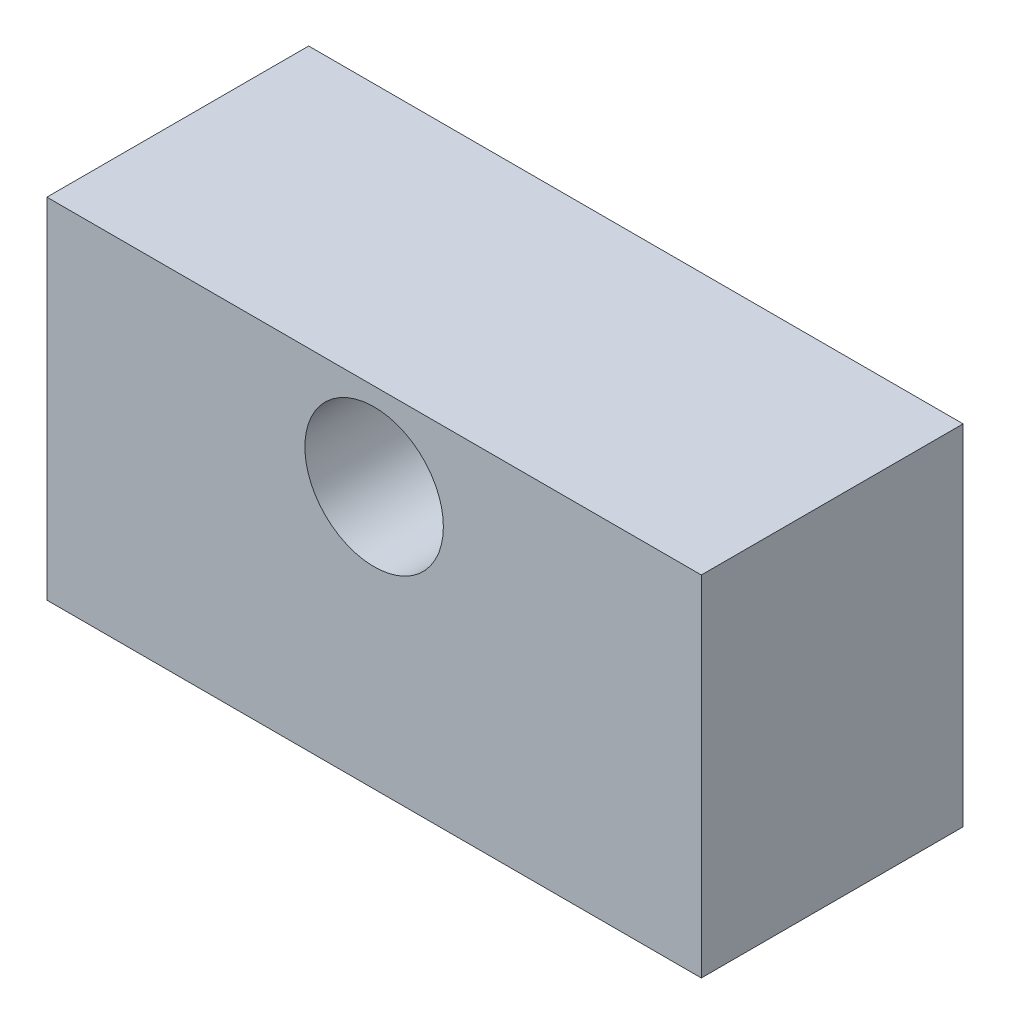
ISO-10303-21;
HEADER;
FILE_DESCRIPTION(('STEP AP214'),'2;1');
FILE_NAME('part.step','',(''),(''),'','','');
FILE_SCHEMA(('AUTOMOTIVE_DESIGN { 1 0 10303 214 1 1 1 1 }'));
ENDSEC;
DATA;
#1=APPLICATION_CONTEXT('core data for automotive mechanical design processes');
#2=APPLICATION_PROTOCOL_DEFINITION('international standard','automotive_design',2000,#1);
#3=PRODUCT_CONTEXT('',#1,'mechanical');
#4=PRODUCT('Part','Part','',(#3));
#5=PRODUCT_RELATED_PRODUCT_CATEGORY('part','',(#4));
#6=PRODUCT_DEFINITION_FORMATION('','',#4);
#7=PRODUCT_DEFINITION_CONTEXT('part definition',#1,'design');
#8=PRODUCT_DEFINITION('design','',#6,#7);
#9=PRODUCT_DEFINITION_SHAPE('','',#8);
#10=(LENGTH_UNIT() NAMED_UNIT(*) SI_UNIT(.MILLI.,.METRE.));
#11=(NAMED_UNIT(*) PLANE_ANGLE_UNIT() SI_UNIT($,.RADIAN.));
#12=(NAMED_UNIT(*) SI_UNIT($,.STERADIAN.) SOLID_ANGLE_UNIT());
#13=UNCERTAINTY_MEASURE_WITH_UNIT(LENGTH_MEASURE(1.E-05),#10,'distance_accuracy_value','');
#14=(GEOMETRIC_REPRESENTATION_CONTEXT(3) GLOBAL_UNCERTAINTY_ASSIGNED_CONTEXT((#13)) GLOBAL_UNIT_ASSIGNED_CONTEXT((#10,
#11,#12)) REPRESENTATION_CONTEXT('',''));
#15=CARTESIAN_POINT('',(0.,0.,0.));
#16=DIRECTION('',(0.,0.,1.));
#17=DIRECTION('',(1.,0.,0.));
#18=AXIS2_PLACEMENT_3D('',#15,#16,#17);
#19=CARTESIAN_POINT('',(0.,0.,12.));
#20=DIRECTION('',(0.,0.,1.));
#21=DIRECTION('',(1.,0.,0.));
#22=AXIS2_PLACEMENT_3D('',#19,#20,#21);
#23=PLANE('',#22);
#24=DIRECTION('',(0.,-1.,0.));
#25=VECTOR('',#24,1.);
#26=CARTESIAN_POINT('',(-15.,4.,12.));
#27=LINE('',#26,#25);
#28=CARTESIAN_POINT('',(-15.,4.,12.));
#29=VERTEX_POINT('',#28);
#30=CARTESIAN_POINT('',(-15.,-12.,12.));
#31=VERTEX_POINT('',#30);
#32=EDGE_CURVE('E94',#29,#31,#27,.T.);
#33=ORIENTED_EDGE('',*,*,#32,.T.);
#34=DIRECTION('',(1.,0.,0.));
#35=VECTOR('',#34,1.);
#36=CARTESIAN_POINT('',(-15.,-12.,12.));
#37=LINE('',#36,#35);
#38=CARTESIAN_POINT('',(15.,-12.,12.));
#39=VERTEX_POINT('',#38);
#40=EDGE_CURVE('E89',#31,#39,#37,.T.);
#41=ORIENTED_EDGE('',*,*,#40,.T.);
#42=DIRECTION('',(0.,1.,0.));
#43=VECTOR('',#42,1.);
#44=CARTESIAN_POINT('',(15.,-12.,12.));
#45=LINE('',#44,#43);
#46=CARTESIAN_POINT('',(15.,4.,12.));
#47=VERTEX_POINT('',#46);
#48=EDGE_CURVE('E93',#39,#47,#45,.T.);
#49=ORIENTED_EDGE('',*,*,#48,.T.);
#50=DIRECTION('',(-1.,0.,0.));
#51=VECTOR('',#50,1.);
#52=CARTESIAN_POINT('',(15.,4.,12.));
#53=LINE('',#52,#51);
#54=EDGE_CURVE('E58',#47,#29,#53,.T.);
#55=ORIENTED_EDGE('',*,*,#54,.T.);
#56=EDGE_LOOP('',(#33,#41,#49,#55));
#57=FACE_BOUND('',#56,.T.);
#58=CARTESIAN_POINT('',(0.,0.,12.));
#59=DIRECTION('',(0.,0.,1.));
#60=DIRECTION('',(1.,0.,0.));
#61=AXIS2_PLACEMENT_3D('',#58,#59,#60);
#62=CIRCLE('',#61,3.175);
#63=CARTESIAN_POINT('',(3.175,0.,12.));
#64=VERTEX_POINT('',#63);
#65=EDGE_CURVE('E106',#64,#64,#62,.T.);
#66=ORIENTED_EDGE('',*,*,#65,.F.);
#67=EDGE_LOOP('',(#66));
#68=FACE_BOUND('',#67,.T.);
#69=ADVANCED_FACE('F43',(#57,#68),#23,.T.);
#70=CARTESIAN_POINT('',(0.,0.,0.));
#71=DIRECTION('',(0.,0.,1.));
#72=DIRECTION('',(1.,0.,0.));
#73=AXIS2_PLACEMENT_3D('',#70,#71,#72);
#74=PLANE('',#73);
#75=DIRECTION('',(0.,-1.,0.));
#76=VECTOR('',#75,1.);
#77=CARTESIAN_POINT('',(-15.,4.,0.));
#78=LINE('',#77,#76);
#79=CARTESIAN_POINT('',(-15.,4.,0.));
#80=VERTEX_POINT('',#79);
#81=CARTESIAN_POINT('',(-15.,-12.,0.));
#82=VERTEX_POINT('',#81);
#83=EDGE_CURVE('E110',#80,#82,#78,.T.);
#84=ORIENTED_EDGE('',*,*,#83,.F.);
#85=DIRECTION('',(-1.,0.,0.));
#86=VECTOR('',#85,1.);
#87=CARTESIAN_POINT('',(15.,4.,0.));
#88=LINE('',#87,#86);
#89=CARTESIAN_POINT('',(15.,4.,0.));
#90=VERTEX_POINT('',#89);
#91=EDGE_CURVE('E81',#90,#80,#88,.T.);
#92=ORIENTED_EDGE('',*,*,#91,.F.);
#93=DIRECTION('',(0.,1.,0.));
#94=VECTOR('',#93,1.);
#95=CARTESIAN_POINT('',(15.,-12.,0.));
#96=LINE('',#95,#94);
#97=CARTESIAN_POINT('',(15.,-12.,0.));
#98=VERTEX_POINT('',#97);
#99=EDGE_CURVE('E77',#98,#90,#96,.T.);
#100=ORIENTED_EDGE('',*,*,#99,.F.);
#101=DIRECTION('',(1.,0.,0.));
#102=VECTOR('',#101,1.);
#103=CARTESIAN_POINT('',(-15.,-12.,0.));
#104=LINE('',#103,#102);
#105=EDGE_CURVE('E98',#82,#98,#104,.T.);
#106=ORIENTED_EDGE('',*,*,#105,.F.);
#107=EDGE_LOOP('',(#84,#92,#100,#106));
#108=FACE_BOUND('',#107,.T.);
#109=CARTESIAN_POINT('',(0.,0.,0.));
#110=DIRECTION('',(0.,0.,1.));
#111=DIRECTION('',(1.,0.,0.));
#112=AXIS2_PLACEMENT_3D('',#109,#110,#111);
#113=CIRCLE('',#112,3.175);
#114=CARTESIAN_POINT('',(3.175,0.,0.));
#115=VERTEX_POINT('',#114);
#116=EDGE_CURVE('E122',#115,#115,#113,.T.);
#117=ORIENTED_EDGE('',*,*,#116,.T.);
#118=EDGE_LOOP('',(#117));
#119=FACE_BOUND('',#118,.T.);
#120=ADVANCED_FACE('F118',(#108,#119),#74,.F.);
#121=CARTESIAN_POINT('',(-15.,4.,12.));
#122=DIRECTION('',(1.,0.,0.));
#123=DIRECTION('',(0.,0.,-1.));
#124=AXIS2_PLACEMENT_3D('',#121,#122,#123);
#125=PLANE('',#124);
#126=ORIENTED_EDGE('',*,*,#83,.T.);
#127=DIRECTION('',(0.,0.,-1.));
#128=VECTOR('',#127,1.);
#129=CARTESIAN_POINT('',(-15.,-12.,12.));
#130=LINE('',#129,#128);
#131=EDGE_CURVE('E11',#31,#82,#130,.T.);
#132=ORIENTED_EDGE('',*,*,#131,.F.);
#133=ORIENTED_EDGE('',*,*,#32,.F.);
#134=DIRECTION('',(0.,0.,-1.));
#135=VECTOR('',#134,1.);
#136=CARTESIAN_POINT('',(-15.,4.,12.));
#137=LINE('',#136,#135);
#138=EDGE_CURVE('E104',#29,#80,#137,.T.);
#139=ORIENTED_EDGE('',*,*,#138,.T.);
#140=EDGE_LOOP('',(#126,#132,#133,#139));
#141=FACE_BOUND('',#140,.T.);
#142=ADVANCED_FACE('F44',(#141),#125,.F.);
#143=CARTESIAN_POINT('',(-15.,-12.,12.));
#144=DIRECTION('',(0.,1.,0.));
#145=DIRECTION('',(0.,0.,1.));
#146=AXIS2_PLACEMENT_3D('',#143,#144,#145);
#147=PLANE('',#146);
#148=ORIENTED_EDGE('',*,*,#105,.T.);
#149=DIRECTION('',(0.,0.,-1.));
#150=VECTOR('',#149,1.);
#151=CARTESIAN_POINT('',(15.,-12.,12.));
#152=LINE('',#151,#150);
#153=EDGE_CURVE('E55',#39,#98,#152,.T.);
#154=ORIENTED_EDGE('',*,*,#153,.F.);
#155=ORIENTED_EDGE('',*,*,#40,.F.);
#156=ORIENTED_EDGE('',*,*,#131,.T.);
#157=EDGE_LOOP('',(#148,#154,#155,#156));
#158=FACE_BOUND('',#157,.T.);
#159=ADVANCED_FACE('F97',(#158),#147,.F.);
#160=CARTESIAN_POINT('',(15.,-12.,12.));
#161=DIRECTION('',(-1.,0.,0.));
#162=DIRECTION('',(0.,0.,1.));
#163=AXIS2_PLACEMENT_3D('',#160,#161,#162);
#164=PLANE('',#163);
#165=ORIENTED_EDGE('',*,*,#99,.T.);
#166=DIRECTION('',(0.,0.,-1.));
#167=VECTOR('',#166,1.);
#168=CARTESIAN_POINT('',(15.,4.,12.));
#169=LINE('',#168,#167);
#170=EDGE_CURVE('E99',#47,#90,#169,.T.);
#171=ORIENTED_EDGE('',*,*,#170,.F.);
#172=ORIENTED_EDGE('',*,*,#48,.F.);
#173=ORIENTED_EDGE('',*,*,#153,.T.);
#174=EDGE_LOOP('',(#165,#171,#172,#173));
#175=FACE_BOUND('',#174,.T.);
#176=ADVANCED_FACE('F102',(#175),#164,.F.);
#177=CARTESIAN_POINT('',(15.,4.,12.));
#178=DIRECTION('',(0.,-1.,0.));
#179=DIRECTION('',(0.,0.,-1.));
#180=AXIS2_PLACEMENT_3D('',#177,#178,#179);
#181=PLANE('',#180);
#182=ORIENTED_EDGE('',*,*,#91,.T.);
#183=ORIENTED_EDGE('',*,*,#138,.F.);
#184=ORIENTED_EDGE('',*,*,#54,.F.);
#185=ORIENTED_EDGE('',*,*,#170,.T.);
#186=EDGE_LOOP('',(#182,#183,#184,#185));
#187=FACE_BOUND('',#186,.T.);
#188=ADVANCED_FACE('F113',(#187),#181,.F.);
#189=CARTESIAN_POINT('',(0.,0.,12.));
#190=DIRECTION('',(0.,0.,-1.));
#191=DIRECTION('',(-1.,0.,0.));
#192=AXIS2_PLACEMENT_3D('',#189,#190,#191);
#193=CYLINDRICAL_SURFACE('',#192,3.175);
#194=ORIENTED_EDGE('',*,*,#65,.T.);
#195=EDGE_LOOP('',(#194));
#196=FACE_BOUND('',#195,.T.);
#197=ORIENTED_EDGE('',*,*,#116,.F.);
#198=EDGE_LOOP('',(#197));
#199=FACE_BOUND('',#198,.T.);
#200=ADVANCED_FACE('F126',(#196,#199),#193,.F.);
#201=CLOSED_SHELL('',(#69,#120,#142,#159,#176,#188,#200));
#202=MANIFOLD_SOLID_BREP('B2',#201);
#203=ADVANCED_BREP_SHAPE_REPRESENTATION('',(#18,#202),#14);
#204=SHAPE_DEFINITION_REPRESENTATION(#9,#203);
ENDSEC;
END-ISO-10303-21;
